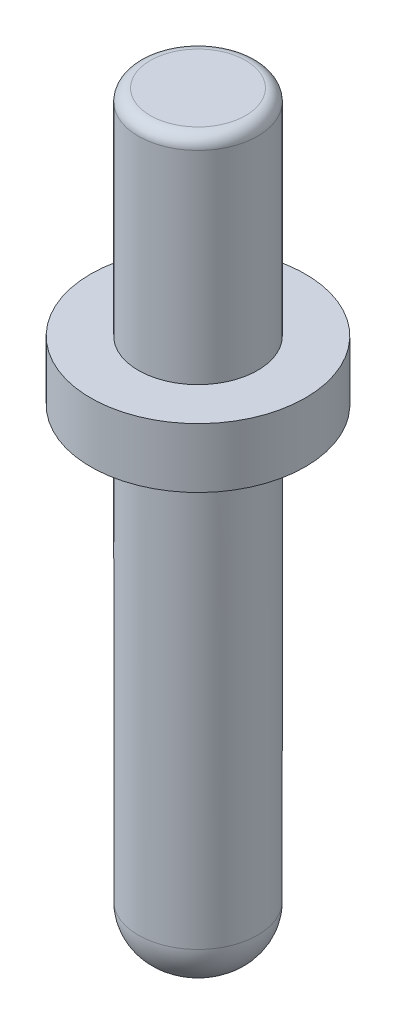
ISO-10303-21;
HEADER;
FILE_DESCRIPTION(('STEP AP214'),'2;1');
FILE_NAME('part.step','',(''),(''),'','','');
FILE_SCHEMA(('AUTOMOTIVE_DESIGN { 1 0 10303 214 1 1 1 1 }'));
ENDSEC;
DATA;
#1=APPLICATION_CONTEXT('core data for automotive mechanical design processes');
#2=APPLICATION_PROTOCOL_DEFINITION('international standard','automotive_design',2000,#1);
#3=PRODUCT_CONTEXT('',#1,'mechanical');
#4=PRODUCT('Part','Part','',(#3));
#5=PRODUCT_RELATED_PRODUCT_CATEGORY('part','',(#4));
#6=PRODUCT_DEFINITION_FORMATION('','',#4);
#7=PRODUCT_DEFINITION_CONTEXT('part definition',#1,'design');
#8=PRODUCT_DEFINITION('design','',#6,#7);
#9=PRODUCT_DEFINITION_SHAPE('','',#8);
#10=(LENGTH_UNIT() NAMED_UNIT(*) SI_UNIT(.MILLI.,.METRE.));
#11=(NAMED_UNIT(*) PLANE_ANGLE_UNIT() SI_UNIT($,.RADIAN.));
#12=(NAMED_UNIT(*) SI_UNIT($,.STERADIAN.) SOLID_ANGLE_UNIT());
#13=UNCERTAINTY_MEASURE_WITH_UNIT(LENGTH_MEASURE(1.E-05),#10,'distance_accuracy_value','');
#14=(GEOMETRIC_REPRESENTATION_CONTEXT(3) GLOBAL_UNCERTAINTY_ASSIGNED_CONTEXT((#13)) GLOBAL_UNIT_ASSIGNED_CONTEXT((#10,
#11,#12)) REPRESENTATION_CONTEXT('',''));
#15=CARTESIAN_POINT('',(0.,0.,0.));
#16=DIRECTION('',(0.,0.,1.));
#17=DIRECTION('',(1.,0.,0.));
#18=AXIS2_PLACEMENT_3D('',#15,#16,#17);
#19=CARTESIAN_POINT('',(0.,-4.,0.));
#20=DIRECTION('',(0.,-1.,0.));
#21=DIRECTION('',(1.,0.,0.));
#22=AXIS2_PLACEMENT_3D('',#19,#20,#21);
#23=PLANE('',#22);
#24=CARTESIAN_POINT('',(0.,-4.,0.));
#25=DIRECTION('',(0.,-1.,0.));
#26=DIRECTION('',(1.,0.,0.));
#27=AXIS2_PLACEMENT_3D('',#24,#25,#26);
#28=CIRCLE('',#27,0.0999999999999998);
#29=CARTESIAN_POINT('',(0.100000000000002,-4.,0.));
#30=VERTEX_POINT('',#29);
#31=EDGE_CURVE('E10',#30,#30,#28,.T.);
#32=ORIENTED_EDGE('',*,*,#31,.T.);
#33=EDGE_LOOP('',(#32));
#34=FACE_BOUND('',#33,.T.);
#35=ADVANCED_FACE('F33',(#34),#23,.T.);
#36=CARTESIAN_POINT('',(0.,13.6872424560707,0.));
#37=DIRECTION('',(0.,1.,0.));
#38=DIRECTION('',(-1.,0.,0.));
#39=AXIS2_PLACEMENT_3D('',#36,#37,#38);
#40=CYLINDRICAL_SURFACE('',#39,0.5);
#41=CARTESIAN_POINT('',(0.,-3.6,0.));
#42=DIRECTION('',(0.,-1.,0.));
#43=DIRECTION('',(1.,0.,0.));
#44=AXIS2_PLACEMENT_3D('',#41,#42,#43);
#45=CIRCLE('',#44,0.5);
#46=CARTESIAN_POINT('',(0.500000000000002,-3.6,0.));
#47=VERTEX_POINT('',#46);
#48=EDGE_CURVE('E40',#47,#47,#45,.F.);
#49=ORIENTED_EDGE('',*,*,#48,.T.);
#50=EDGE_LOOP('',(#49));
#51=FACE_BOUND('',#50,.T.);
#52=CARTESIAN_POINT('',(0.,0.,0.));
#53=DIRECTION('',(0.,1.,0.));
#54=DIRECTION('',(-1.,0.,0.));
#55=AXIS2_PLACEMENT_3D('',#52,#53,#54);
#56=CIRCLE('',#55,0.5);
#57=CARTESIAN_POINT('',(-0.499999999999998,0.,0.));
#58=VERTEX_POINT('',#57);
#59=EDGE_CURVE('E53',#58,#58,#56,.T.);
#60=ORIENTED_EDGE('',*,*,#59,.F.);
#61=EDGE_LOOP('',(#60));
#62=FACE_BOUND('',#61,.T.);
#63=ADVANCED_FACE('F84',(#51,#62),#40,.T.);
#64=CARTESIAN_POINT('',(-0.499999999999998,0.,0.));
#65=DIRECTION('',(0.,-1.,0.));
#66=DIRECTION('',(1.,0.,0.));
#67=AXIS2_PLACEMENT_3D('',#64,#65,#66);
#68=PLANE('',#67);
#69=ORIENTED_EDGE('',*,*,#59,.T.);
#70=EDGE_LOOP('',(#69));
#71=FACE_BOUND('',#70,.T.);
#72=CARTESIAN_POINT('',(0.,0.,0.));
#73=DIRECTION('',(0.,1.,0.));
#74=DIRECTION('',(-1.,0.,0.));
#75=AXIS2_PLACEMENT_3D('',#72,#73,#74);
#76=CIRCLE('',#75,0.9);
#77=CARTESIAN_POINT('',(-0.899999999999998,0.,0.));
#78=VERTEX_POINT('',#77);
#79=EDGE_CURVE('E56',#78,#78,#76,.T.);
#80=ORIENTED_EDGE('',*,*,#79,.F.);
#81=EDGE_LOOP('',(#80));
#82=FACE_BOUND('',#81,.T.);
#83=ADVANCED_FACE('F80',(#71,#82),#68,.T.);
#84=CARTESIAN_POINT('',(0.,13.6872424560707,0.));
#85=DIRECTION('',(0.,1.,0.));
#86=DIRECTION('',(-1.,0.,0.));
#87=AXIS2_PLACEMENT_3D('',#84,#85,#86);
#88=CYLINDRICAL_SURFACE('',#87,0.9);
#89=ORIENTED_EDGE('',*,*,#79,.T.);
#90=EDGE_LOOP('',(#89));
#91=FACE_BOUND('',#90,.T.);
#92=CARTESIAN_POINT('',(0.,0.499999999999999,0.));
#93=DIRECTION('',(0.,1.,0.));
#94=DIRECTION('',(-1.,0.,0.));
#95=AXIS2_PLACEMENT_3D('',#92,#93,#94);
#96=CIRCLE('',#95,0.9);
#97=CARTESIAN_POINT('',(-0.899999999999998,0.499999999999999,0.));
#98=VERTEX_POINT('',#97);
#99=EDGE_CURVE('E59',#98,#98,#96,.T.);
#100=ORIENTED_EDGE('',*,*,#99,.F.);
#101=EDGE_LOOP('',(#100));
#102=FACE_BOUND('',#101,.T.);
#103=ADVANCED_FACE('F70',(#91,#102),#88,.T.);
#104=CARTESIAN_POINT('',(-0.899999999999998,0.499999999999999,0.));
#105=DIRECTION('',(0.,1.,0.));
#106=DIRECTION('',(-1.,0.,0.));
#107=AXIS2_PLACEMENT_3D('',#104,#105,#106);
#108=PLANE('',#107);
#109=ORIENTED_EDGE('',*,*,#99,.T.);
#110=EDGE_LOOP('',(#109));
#111=FACE_BOUND('',#110,.T.);
#112=CARTESIAN_POINT('',(0.,0.499999999999999,0.));
#113=DIRECTION('',(0.,1.,0.));
#114=DIRECTION('',(-1.,0.,0.));
#115=AXIS2_PLACEMENT_3D('',#112,#113,#114);
#116=CIRCLE('',#115,0.5);
#117=CARTESIAN_POINT('',(-0.499999999999998,0.499999999999999,0.));
#118=VERTEX_POINT('',#117);
#119=EDGE_CURVE('E62',#118,#118,#116,.T.);
#120=ORIENTED_EDGE('',*,*,#119,.F.);
#121=EDGE_LOOP('',(#120));
#122=FACE_BOUND('',#121,.T.);
#123=ADVANCED_FACE('F68',(#111,#122),#108,.T.);
#124=CARTESIAN_POINT('',(0.,13.6872424560707,0.));
#125=DIRECTION('',(0.,1.,0.));
#126=DIRECTION('',(-1.,0.,0.));
#127=AXIS2_PLACEMENT_3D('',#124,#125,#126);
#128=CYLINDRICAL_SURFACE('',#127,0.5);
#129=CARTESIAN_POINT('',(0.,2.2,0.));
#130=DIRECTION('',(0.,1.,0.));
#131=DIRECTION('',(-1.,0.,0.));
#132=AXIS2_PLACEMENT_3D('',#129,#130,#131);
#133=CIRCLE('',#132,0.5);
#134=CARTESIAN_POINT('',(-0.499999999999998,2.2,0.));
#135=VERTEX_POINT('',#134);
#136=EDGE_CURVE('E44',#135,#135,#133,.F.);
#137=ORIENTED_EDGE('',*,*,#136,.T.);
#138=EDGE_LOOP('',(#137));
#139=FACE_BOUND('',#138,.T.);
#140=ORIENTED_EDGE('',*,*,#119,.T.);
#141=EDGE_LOOP('',(#140));
#142=FACE_BOUND('',#141,.T.);
#143=ADVANCED_FACE('F66',(#139,#142),#128,.T.);
#144=CARTESIAN_POINT('',(-0.499999999999998,2.3,0.));
#145=DIRECTION('',(0.,1.,0.));
#146=DIRECTION('',(-1.,0.,0.));
#147=AXIS2_PLACEMENT_3D('',#144,#145,#146);
#148=PLANE('',#147);
#149=CARTESIAN_POINT('',(0.,2.3,0.));
#150=DIRECTION('',(0.,1.,0.));
#151=DIRECTION('',(-1.,0.,0.));
#152=AXIS2_PLACEMENT_3D('',#149,#150,#151);
#153=CIRCLE('',#152,0.4);
#154=CARTESIAN_POINT('',(-0.399999999999998,2.3,0.));
#155=VERTEX_POINT('',#154);
#156=EDGE_CURVE('E48',#155,#155,#153,.T.);
#157=ORIENTED_EDGE('',*,*,#156,.T.);
#158=EDGE_LOOP('',(#157));
#159=FACE_BOUND('',#158,.T.);
#160=ADVANCED_FACE('F77',(#159),#148,.T.);
#161=CARTESIAN_POINT('',(0.,2.2,0.));
#162=DIRECTION('',(0.,1.,0.));
#163=DIRECTION('',(-1.,0.,0.));
#164=AXIS2_PLACEMENT_3D('',#161,#162,#163);
#165=TOROIDAL_SURFACE('',#164,0.4,0.1);
#166=ORIENTED_EDGE('',*,*,#136,.F.);
#167=EDGE_LOOP('',(#166));
#168=FACE_BOUND('',#167,.T.);
#169=ORIENTED_EDGE('',*,*,#156,.F.);
#170=EDGE_LOOP('',(#169));
#171=FACE_BOUND('',#170,.T.);
#172=ADVANCED_FACE('F91',(#168,#171),#165,.T.);
#173=CARTESIAN_POINT('',(0.,-3.6,0.));
#174=DIRECTION('',(0.,-1.,0.));
#175=DIRECTION('',(1.,0.,0.));
#176=AXIS2_PLACEMENT_3D('',#173,#174,#175);
#177=DEGENERATE_TOROIDAL_SURFACE('',#176,0.0999999999999998,0.4,.T.);
#178=ORIENTED_EDGE('',*,*,#31,.F.);
#179=EDGE_LOOP('',(#178));
#180=FACE_BOUND('',#179,.T.);
#181=ORIENTED_EDGE('',*,*,#48,.F.);
#182=EDGE_LOOP('',(#181));
#183=FACE_BOUND('',#182,.T.);
#184=ADVANCED_FACE('F35',(#180,#183),#177,.T.);
#185=CLOSED_SHELL('',(#35,#63,#83,#103,#123,#143,#160,#172,#184));
#186=MANIFOLD_SOLID_BREP('B2',#185);
#187=ADVANCED_BREP_SHAPE_REPRESENTATION('',(#18,#186),#14);
#188=SHAPE_DEFINITION_REPRESENTATION(#9,#187);
ENDSEC;
END-ISO-10303-21;
